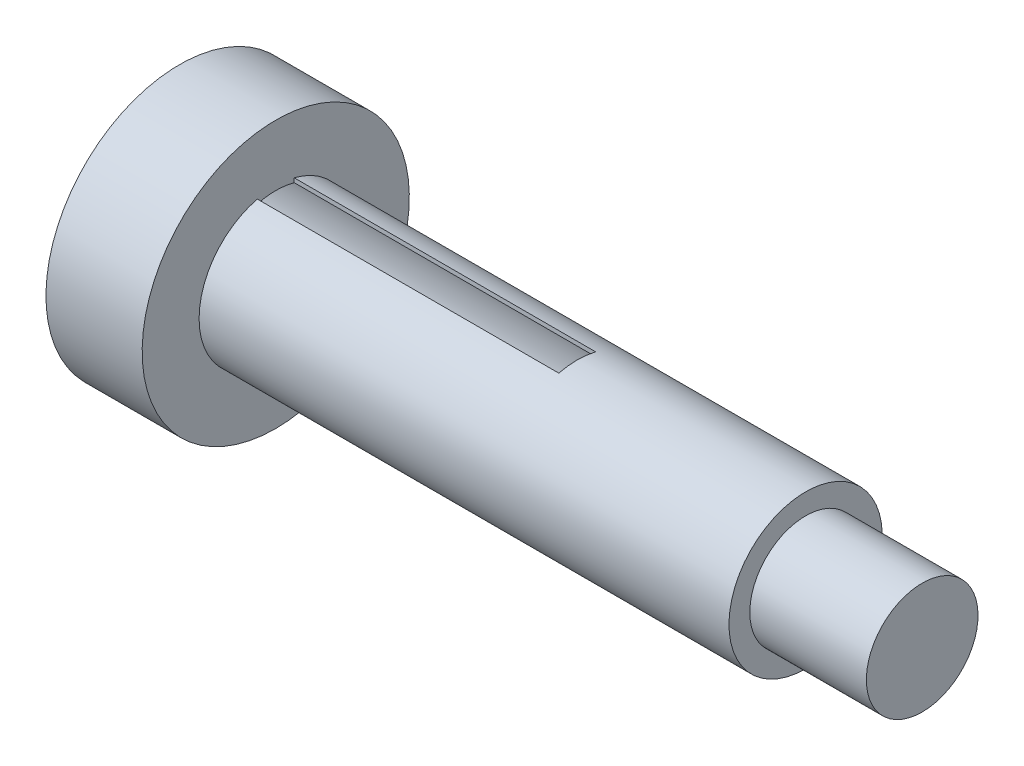
ISO-10303-21;
HEADER;
FILE_DESCRIPTION(('STEP AP214'),'2;1');
FILE_NAME('part.step','',(''),(''),'','','');
FILE_SCHEMA(('AUTOMOTIVE_DESIGN { 1 0 10303 214 1 1 1 1 }'));
ENDSEC;
DATA;
#1=APPLICATION_CONTEXT('core data for automotive mechanical design processes');
#2=APPLICATION_PROTOCOL_DEFINITION('international standard','automotive_design',2000,#1);
#3=PRODUCT_CONTEXT('',#1,'mechanical');
#4=PRODUCT('Part','Part','',(#3));
#5=PRODUCT_RELATED_PRODUCT_CATEGORY('part','',(#4));
#6=PRODUCT_DEFINITION_FORMATION('','',#4);
#7=PRODUCT_DEFINITION_CONTEXT('part definition',#1,'design');
#8=PRODUCT_DEFINITION('design','',#6,#7);
#9=PRODUCT_DEFINITION_SHAPE('','',#8);
#10=(LENGTH_UNIT() NAMED_UNIT(*) SI_UNIT(.MILLI.,.METRE.));
#11=(NAMED_UNIT(*) PLANE_ANGLE_UNIT() SI_UNIT($,.RADIAN.));
#12=(NAMED_UNIT(*) SI_UNIT($,.STERADIAN.) SOLID_ANGLE_UNIT());
#13=UNCERTAINTY_MEASURE_WITH_UNIT(LENGTH_MEASURE(1.E-05),#10,'distance_accuracy_value','');
#14=(GEOMETRIC_REPRESENTATION_CONTEXT(3) GLOBAL_UNCERTAINTY_ASSIGNED_CONTEXT((#13)) GLOBAL_UNIT_ASSIGNED_CONTEXT((#10,
#11,#12)) REPRESENTATION_CONTEXT('',''));
#15=CARTESIAN_POINT('',(0.,0.,0.));
#16=DIRECTION('',(0.,0.,1.));
#17=DIRECTION('',(1.,0.,0.));
#18=AXIS2_PLACEMENT_3D('',#15,#16,#17);
#19=CARTESIAN_POINT('',(191.14,0.,0.));
#20=DIRECTION('',(-1.,0.,0.));
#21=DIRECTION('',(0.,-1.,0.));
#22=AXIS2_PLACEMENT_3D('',#19,#20,#21);
#23=PLANE('',#22);
#24=CARTESIAN_POINT('',(191.14,0.,0.));
#25=DIRECTION('',(-1.,0.,0.));
#26=DIRECTION('',(0.,-1.,0.));
#27=AXIS2_PLACEMENT_3D('',#24,#25,#26);
#28=CIRCLE('',#27,14.37);
#29=CARTESIAN_POINT('',(191.14,-14.37,0.));
#30=VERTEX_POINT('',#29);
#31=EDGE_CURVE('E120',#30,#30,#28,.T.);
#32=ORIENTED_EDGE('',*,*,#31,.F.);
#33=EDGE_LOOP('',(#32));
#34=FACE_BOUND('',#33,.T.);
#35=ADVANCED_FACE('F45',(#34),#23,.F.);
#36=CARTESIAN_POINT('',(0.,0.,0.));
#37=DIRECTION('',(-1.,0.,0.));
#38=DIRECTION('',(0.,-1.,0.));
#39=AXIS2_PLACEMENT_3D('',#36,#37,#38);
#40=CYLINDRICAL_SURFACE('',#39,14.37);
#41=CARTESIAN_POINT('',(161.14,0.,0.));
#42=DIRECTION('',(-1.,0.,0.));
#43=DIRECTION('',(0.,-1.,0.));
#44=AXIS2_PLACEMENT_3D('',#41,#42,#43);
#45=CIRCLE('',#44,14.37);
#46=CARTESIAN_POINT('',(161.14,-14.37,0.));
#47=VERTEX_POINT('',#46);
#48=EDGE_CURVE('E222',#47,#47,#45,.T.);
#49=ORIENTED_EDGE('',*,*,#48,.F.);
#50=EDGE_LOOP('',(#49));
#51=FACE_BOUND('',#50,.T.);
#52=ORIENTED_EDGE('',*,*,#31,.T.);
#53=EDGE_LOOP('',(#52));
#54=FACE_BOUND('',#53,.T.);
#55=ADVANCED_FACE('F231',(#51,#54),#40,.T.);
#56=CARTESIAN_POINT('',(161.14,14.37,0.));
#57=DIRECTION('',(-1.,0.,0.));
#58=DIRECTION('',(0.,-1.,0.));
#59=AXIS2_PLACEMENT_3D('',#56,#57,#58);
#60=PLANE('',#59);
#61=CARTESIAN_POINT('',(161.14,0.,0.));
#62=DIRECTION('',(-1.,0.,0.));
#63=DIRECTION('',(0.,-1.,0.));
#64=AXIS2_PLACEMENT_3D('',#61,#62,#63);
#65=CIRCLE('',#64,19.73);
#66=CARTESIAN_POINT('',(161.14,-19.73,0.));
#67=VERTEX_POINT('',#66);
#68=EDGE_CURVE('E218',#67,#67,#65,.T.);
#69=ORIENTED_EDGE('',*,*,#68,.F.);
#70=EDGE_LOOP('',(#69));
#71=FACE_BOUND('',#70,.T.);
#72=ORIENTED_EDGE('',*,*,#48,.T.);
#73=EDGE_LOOP('',(#72));
#74=FACE_BOUND('',#73,.T.);
#75=ADVANCED_FACE('F237',(#71,#74),#60,.F.);
#76=CARTESIAN_POINT('',(0.,0.,0.));
#77=DIRECTION('',(-1.,0.,0.));
#78=DIRECTION('',(0.,-1.,0.));
#79=AXIS2_PLACEMENT_3D('',#76,#77,#78);
#80=CYLINDRICAL_SURFACE('',#79,19.73);
#81=CARTESIAN_POINT('',(24.76,0.,0.));
#82=DIRECTION('',(-1.,0.,0.));
#83=DIRECTION('',(0.,-1.,0.));
#84=AXIS2_PLACEMENT_3D('',#81,#82,#83);
#85=CIRCLE('',#84,19.73);
#86=CARTESIAN_POINT('',(24.76,19.15092360697,-4.74499999999999));
#87=VERTEX_POINT('',#86);
#88=CARTESIAN_POINT('',(24.76,-19.15092360697,-4.74499999999999));
#89=VERTEX_POINT('',#88);
#90=EDGE_CURVE('E166',#87,#89,#85,.T.);
#91=ORIENTED_EDGE('',*,*,#90,.F.);
#92=DIRECTION('',(-1.,0.,0.));
#93=VECTOR('',#92,1.);
#94=CARTESIAN_POINT('',(0.,19.15092360697,-4.74499999999999));
#95=LINE('',#94,#93);
#96=CARTESIAN_POINT('',(102.36,19.15092360697,-4.745));
#97=VERTEX_POINT('',#96);
#98=EDGE_CURVE('E192',#87,#97,#95,.F.);
#99=ORIENTED_EDGE('',*,*,#98,.T.);
#100=CARTESIAN_POINT('',(102.36,0.,0.));
#101=DIRECTION('',(1.,0.,0.));
#102=DIRECTION('',(0.,0.,-1.));
#103=AXIS2_PLACEMENT_3D('',#100,#101,#102);
#104=CIRCLE('',#103,19.73);
#105=CARTESIAN_POINT('',(102.36,19.15092360697,4.745));
#106=VERTEX_POINT('',#105);
#107=EDGE_CURVE('E191',#97,#106,#104,.T.);
#108=ORIENTED_EDGE('',*,*,#107,.T.);
#109=DIRECTION('',(-1.,0.,0.));
#110=VECTOR('',#109,1.);
#111=CARTESIAN_POINT('',(0.,19.15092360697,4.74500000000001));
#112=LINE('',#111,#110);
#113=CARTESIAN_POINT('',(24.76,19.15092360697,4.74500000000001));
#114=VERTEX_POINT('',#113);
#115=EDGE_CURVE('E176',#106,#114,#112,.T.);
#116=ORIENTED_EDGE('',*,*,#115,.T.);
#117=CARTESIAN_POINT('',(24.76,-19.15092360697,4.74500000000001));
#118=VERTEX_POINT('',#117);
#119=EDGE_CURVE('E215',#118,#114,#85,.T.);
#120=ORIENTED_EDGE('',*,*,#119,.F.);
#121=DIRECTION('',(-1.,0.,0.));
#122=VECTOR('',#121,1.);
#123=CARTESIAN_POINT('',(0.,-19.15092360697,4.74500000000001));
#124=LINE('',#123,#122);
#125=CARTESIAN_POINT('',(102.36,-19.15092360697,4.74500000000001));
#126=VERTEX_POINT('',#125);
#127=EDGE_CURVE('E170',#118,#126,#124,.F.);
#128=ORIENTED_EDGE('',*,*,#127,.T.);
#129=CARTESIAN_POINT('',(102.36,-19.15092360697,-4.745));
#130=VERTEX_POINT('',#129);
#131=EDGE_CURVE('E127',#126,#130,#104,.T.);
#132=ORIENTED_EDGE('',*,*,#131,.T.);
#133=DIRECTION('',(-1.,0.,0.));
#134=VECTOR('',#133,1.);
#135=CARTESIAN_POINT('',(0.,-19.15092360697,-4.74499999999999));
#136=LINE('',#135,#134);
#137=EDGE_CURVE('E196',#130,#89,#136,.T.);
#138=ORIENTED_EDGE('',*,*,#137,.T.);
#139=EDGE_LOOP('',(#91,#99,#108,#116,#120,#128,#132,#138));
#140=FACE_BOUND('',#139,.T.);
#141=ORIENTED_EDGE('',*,*,#68,.T.);
#142=EDGE_LOOP('',(#141));
#143=FACE_BOUND('',#142,.T.);
#144=ADVANCED_FACE('F242',(#140,#143),#80,.T.);
#145=CARTESIAN_POINT('',(24.76,19.73,0.));
#146=DIRECTION('',(-1.,0.,0.));
#147=DIRECTION('',(0.,-1.,0.));
#148=AXIS2_PLACEMENT_3D('',#145,#146,#147);
#149=PLANE('',#148);
#150=ORIENTED_EDGE('',*,*,#119,.T.);
#151=DIRECTION('',(0.,1.,0.));
#152=VECTOR('',#151,1.);
#153=CARTESIAN_POINT('',(24.76,-34.38,4.74500000000001));
#154=LINE('',#153,#152);
#155=CARTESIAN_POINT('',(24.76,18.0673012649925,4.74500000000001));
#156=VERTEX_POINT('',#155);
#157=EDGE_CURVE('E70',#156,#114,#154,.T.);
#158=ORIENTED_EDGE('',*,*,#157,.F.);
#159=CARTESIAN_POINT('',(24.76,0.,0.));
#160=DIRECTION('',(-1.,0.,0.));
#161=DIRECTION('',(0.,0.,1.));
#162=AXIS2_PLACEMENT_3D('',#159,#160,#161);
#163=CIRCLE('',#162,18.68);
#164=CARTESIAN_POINT('',(24.76,18.0673012649925,-4.74499999999999));
#165=VERTEX_POINT('',#164);
#166=EDGE_CURVE('E11',#165,#156,#163,.F.);
#167=ORIENTED_EDGE('',*,*,#166,.F.);
#168=DIRECTION('',(0.,1.,0.));
#169=VECTOR('',#168,1.);
#170=CARTESIAN_POINT('',(24.76,-34.38,-4.74499999999999));
#171=LINE('',#170,#169);
#172=EDGE_CURVE('E171',#165,#87,#171,.T.);
#173=ORIENTED_EDGE('',*,*,#172,.T.);
#174=ORIENTED_EDGE('',*,*,#90,.T.);
#175=CARTESIAN_POINT('',(24.76,-18.0673012649925,-4.74499999999999));
#176=VERTEX_POINT('',#175);
#177=EDGE_CURVE('E163',#89,#176,#171,.T.);
#178=ORIENTED_EDGE('',*,*,#177,.T.);
#179=CARTESIAN_POINT('',(24.76,-18.0673012649925,4.74500000000001));
#180=VERTEX_POINT('',#179);
#181=EDGE_CURVE('E55',#180,#176,#163,.F.);
#182=ORIENTED_EDGE('',*,*,#181,.F.);
#183=EDGE_CURVE('E113',#118,#180,#154,.T.);
#184=ORIENTED_EDGE('',*,*,#183,.F.);
#185=EDGE_LOOP('',(#150,#158,#167,#173,#174,#178,#182,#184));
#186=FACE_BOUND('',#185,.T.);
#187=CARTESIAN_POINT('',(24.76,0.,0.));
#188=DIRECTION('',(-1.,0.,0.));
#189=DIRECTION('',(0.,-1.,0.));
#190=AXIS2_PLACEMENT_3D('',#187,#188,#189);
#191=CIRCLE('',#190,34.38);
#192=CARTESIAN_POINT('',(24.76,-34.38,0.));
#193=VERTEX_POINT('',#192);
#194=EDGE_CURVE('E211',#193,#193,#191,.T.);
#195=ORIENTED_EDGE('',*,*,#194,.F.);
#196=EDGE_LOOP('',(#195));
#197=FACE_BOUND('',#196,.T.);
#198=ADVANCED_FACE('F159',(#186,#197),#149,.F.);
#199=CARTESIAN_POINT('',(0.,0.,0.));
#200=DIRECTION('',(-1.,0.,0.));
#201=DIRECTION('',(0.,-1.,0.));
#202=AXIS2_PLACEMENT_3D('',#199,#200,#201);
#203=CYLINDRICAL_SURFACE('',#202,34.38);
#204=CARTESIAN_POINT('',(0.,0.,0.));
#205=DIRECTION('',(-1.,0.,0.));
#206=DIRECTION('',(0.,-1.,0.));
#207=AXIS2_PLACEMENT_3D('',#204,#205,#206);
#208=CIRCLE('',#207,34.38);
#209=CARTESIAN_POINT('',(0.,-34.38,0.));
#210=VERTEX_POINT('',#209);
#211=EDGE_CURVE('E207',#210,#210,#208,.T.);
#212=ORIENTED_EDGE('',*,*,#211,.F.);
#213=EDGE_LOOP('',(#212));
#214=FACE_BOUND('',#213,.T.);
#215=ORIENTED_EDGE('',*,*,#194,.T.);
#216=EDGE_LOOP('',(#215));
#217=FACE_BOUND('',#216,.T.);
#218=ADVANCED_FACE('F252',(#214,#217),#203,.T.);
#219=CARTESIAN_POINT('',(0.,34.38,0.));
#220=DIRECTION('',(1.,0.,0.));
#221=DIRECTION('',(0.,1.,0.));
#222=AXIS2_PLACEMENT_3D('',#219,#220,#221);
#223=PLANE('',#222);
#224=CARTESIAN_POINT('',(0.,0.,0.));
#225=DIRECTION('',(-1.,0.,0.));
#226=DIRECTION('',(0.,-1.,0.));
#227=AXIS2_PLACEMENT_3D('',#224,#225,#226);
#228=CIRCLE('',#227,18.68);
#229=CARTESIAN_POINT('',(0.,-18.68,0.));
#230=VERTEX_POINT('',#229);
#231=EDGE_CURVE('E203',#230,#230,#228,.T.);
#232=ORIENTED_EDGE('',*,*,#231,.F.);
#233=EDGE_LOOP('',(#232));
#234=FACE_BOUND('',#233,.T.);
#235=ORIENTED_EDGE('',*,*,#211,.T.);
#236=EDGE_LOOP('',(#235));
#237=FACE_BOUND('',#236,.T.);
#238=ADVANCED_FACE('F255',(#234,#237),#223,.F.);
#239=CARTESIAN_POINT('',(0.,0.,0.));
#240=DIRECTION('',(-1.,0.,0.));
#241=DIRECTION('',(0.,-1.,0.));
#242=AXIS2_PLACEMENT_3D('',#239,#240,#241);
#243=CYLINDRICAL_SURFACE('',#242,18.68);
#244=DIRECTION('',(-1.,0.,0.));
#245=VECTOR('',#244,1.);
#246=CARTESIAN_POINT('',(0.,18.0673012649925,-4.74499999999999));
#247=LINE('',#246,#245);
#248=CARTESIAN_POINT('',(102.36,18.0673012649925,-4.745));
#249=VERTEX_POINT('',#248);
#250=EDGE_CURVE('E48',#249,#165,#247,.T.);
#251=ORIENTED_EDGE('',*,*,#250,.T.);
#252=ORIENTED_EDGE('',*,*,#166,.T.);
#253=DIRECTION('',(-1.,0.,0.));
#254=VECTOR('',#253,1.);
#255=CARTESIAN_POINT('',(0.,18.0673012649925,4.74500000000001));
#256=LINE('',#255,#254);
#257=CARTESIAN_POINT('',(102.36,18.0673012649925,4.74500000000001));
#258=VERTEX_POINT('',#257);
#259=EDGE_CURVE('E145',#156,#258,#256,.F.);
#260=ORIENTED_EDGE('',*,*,#259,.T.);
#261=CARTESIAN_POINT('',(102.36,0.,0.));
#262=DIRECTION('',(1.,0.,0.));
#263=DIRECTION('',(0.,0.,-1.));
#264=AXIS2_PLACEMENT_3D('',#261,#262,#263);
#265=CIRCLE('',#264,18.68);
#266=EDGE_CURVE('E139',#258,#249,#265,.F.);
#267=ORIENTED_EDGE('',*,*,#266,.T.);
#268=EDGE_LOOP('',(#251,#252,#260,#267));
#269=FACE_BOUND('',#268,.T.);
#270=DIRECTION('',(-1.,0.,0.));
#271=VECTOR('',#270,1.);
#272=CARTESIAN_POINT('',(0.,-18.0673012649925,4.74500000000001));
#273=LINE('',#272,#271);
#274=CARTESIAN_POINT('',(102.36,-18.0673012649925,4.745));
#275=VERTEX_POINT('',#274);
#276=EDGE_CURVE('E110',#275,#180,#273,.T.);
#277=ORIENTED_EDGE('',*,*,#276,.T.);
#278=ORIENTED_EDGE('',*,*,#181,.T.);
#279=DIRECTION('',(-1.,0.,0.));
#280=VECTOR('',#279,1.);
#281=CARTESIAN_POINT('',(0.,-18.0673012649925,-4.74499999999999));
#282=LINE('',#281,#280);
#283=CARTESIAN_POINT('',(102.36,-18.0673012649925,-4.745));
#284=VERTEX_POINT('',#283);
#285=EDGE_CURVE('E136',#176,#284,#282,.F.);
#286=ORIENTED_EDGE('',*,*,#285,.T.);
#287=EDGE_CURVE('E119',#284,#275,#265,.F.);
#288=ORIENTED_EDGE('',*,*,#287,.T.);
#289=EDGE_LOOP('',(#277,#278,#286,#288));
#290=FACE_BOUND('',#289,.T.);
#291=CARTESIAN_POINT('',(142.46,0.,0.));
#292=DIRECTION('',(-1.,0.,0.));
#293=DIRECTION('',(0.,-1.,0.));
#294=AXIS2_PLACEMENT_3D('',#291,#292,#293);
#295=CIRCLE('',#294,18.68);
#296=CARTESIAN_POINT('',(142.46,-18.6800000000001,0.));
#297=VERTEX_POINT('',#296);
#298=EDGE_CURVE('E199',#297,#297,#295,.T.);
#299=ORIENTED_EDGE('',*,*,#298,.F.);
#300=EDGE_LOOP('',(#299));
#301=FACE_BOUND('',#300,.T.);
#302=ORIENTED_EDGE('',*,*,#231,.T.);
#303=EDGE_LOOP('',(#302));
#304=FACE_BOUND('',#303,.T.);
#305=ADVANCED_FACE('F134',(#269,#290,#301,#304),#243,.F.);
#306=CARTESIAN_POINT('',(142.46,18.68,0.));
#307=DIRECTION('',(1.,0.,0.));
#308=DIRECTION('',(0.,1.,0.));
#309=AXIS2_PLACEMENT_3D('',#306,#307,#308);
#310=PLANE('',#309);
#311=ORIENTED_EDGE('',*,*,#298,.T.);
#312=EDGE_LOOP('',(#311));
#313=FACE_BOUND('',#312,.T.);
#314=ADVANCED_FACE('F262',(#313),#310,.F.);
#315=CARTESIAN_POINT('',(102.36,-34.38,4.745));
#316=DIRECTION('',(0.,0.,1.));
#317=DIRECTION('',(1.,0.,0.));
#318=AXIS2_PLACEMENT_3D('',#315,#316,#317);
#319=PLANE('',#318);
#320=ORIENTED_EDGE('',*,*,#183,.T.);
#321=ORIENTED_EDGE('',*,*,#276,.F.);
#322=DIRECTION('',(0.,1.,0.));
#323=VECTOR('',#322,1.);
#324=CARTESIAN_POINT('',(102.36,-34.38,4.745));
#325=LINE('',#324,#323);
#326=EDGE_CURVE('E62',#126,#275,#325,.T.);
#327=ORIENTED_EDGE('',*,*,#326,.F.);
#328=ORIENTED_EDGE('',*,*,#127,.F.);
#329=EDGE_LOOP('',(#320,#321,#327,#328));
#330=FACE_BOUND('',#329,.T.);
#331=ADVANCED_FACE('F111',(#330),#319,.F.);
#332=CARTESIAN_POINT('',(102.36,-34.38,-4.745));
#333=DIRECTION('',(1.,0.,0.));
#334=DIRECTION('',(0.,0.,-1.));
#335=AXIS2_PLACEMENT_3D('',#332,#333,#334);
#336=PLANE('',#335);
#337=ORIENTED_EDGE('',*,*,#326,.T.);
#338=ORIENTED_EDGE('',*,*,#287,.F.);
#339=DIRECTION('',(0.,1.,0.));
#340=VECTOR('',#339,1.);
#341=CARTESIAN_POINT('',(102.36,-34.38,-4.745));
#342=LINE('',#341,#340);
#343=EDGE_CURVE('E178',#130,#284,#342,.T.);
#344=ORIENTED_EDGE('',*,*,#343,.F.);
#345=ORIENTED_EDGE('',*,*,#131,.F.);
#346=EDGE_LOOP('',(#337,#338,#344,#345));
#347=FACE_BOUND('',#346,.T.);
#348=ADVANCED_FACE('F123',(#347),#336,.F.);
#349=CARTESIAN_POINT('',(102.36,-34.38,-4.745));
#350=DIRECTION('',(0.,0.,-1.));
#351=DIRECTION('',(-1.,0.,0.));
#352=AXIS2_PLACEMENT_3D('',#349,#350,#351);
#353=PLANE('',#352);
#354=ORIENTED_EDGE('',*,*,#343,.T.);
#355=ORIENTED_EDGE('',*,*,#285,.F.);
#356=ORIENTED_EDGE('',*,*,#177,.F.);
#357=ORIENTED_EDGE('',*,*,#137,.F.);
#358=EDGE_LOOP('',(#354,#355,#356,#357));
#359=FACE_BOUND('',#358,.T.);
#360=ADVANCED_FACE('F274',(#359),#353,.F.);
#361=ORIENTED_EDGE('',*,*,#172,.F.);
#362=ORIENTED_EDGE('',*,*,#250,.F.);
#363=EDGE_CURVE('E130',#249,#97,#342,.T.);
#364=ORIENTED_EDGE('',*,*,#363,.T.);
#365=ORIENTED_EDGE('',*,*,#98,.F.);
#366=EDGE_LOOP('',(#361,#362,#364,#365));
#367=FACE_BOUND('',#366,.T.);
#368=ADVANCED_FACE('F272',(#367),#353,.F.);
#369=ORIENTED_EDGE('',*,*,#363,.F.);
#370=ORIENTED_EDGE('',*,*,#266,.F.);
#371=EDGE_CURVE('E131',#258,#106,#325,.T.);
#372=ORIENTED_EDGE('',*,*,#371,.T.);
#373=ORIENTED_EDGE('',*,*,#107,.F.);
#374=EDGE_LOOP('',(#369,#370,#372,#373));
#375=FACE_BOUND('',#374,.T.);
#376=ADVANCED_FACE('F269',(#375),#336,.F.);
#377=ORIENTED_EDGE('',*,*,#371,.F.);
#378=ORIENTED_EDGE('',*,*,#259,.F.);
#379=ORIENTED_EDGE('',*,*,#157,.T.);
#380=ORIENTED_EDGE('',*,*,#115,.F.);
#381=EDGE_LOOP('',(#377,#378,#379,#380));
#382=FACE_BOUND('',#381,.T.);
#383=ADVANCED_FACE('F266',(#382),#319,.F.);
#384=CLOSED_SHELL('',(#35,#55,#75,#144,#198,#218,#238,#305,#314,#331,#348,#360,#368,#376,#383));
#385=MANIFOLD_SOLID_BREP('B2',#384);
#386=ADVANCED_BREP_SHAPE_REPRESENTATION('',(#18,#385),#14);
#387=SHAPE_DEFINITION_REPRESENTATION(#9,#386);
ENDSEC;
END-ISO-10303-21;
